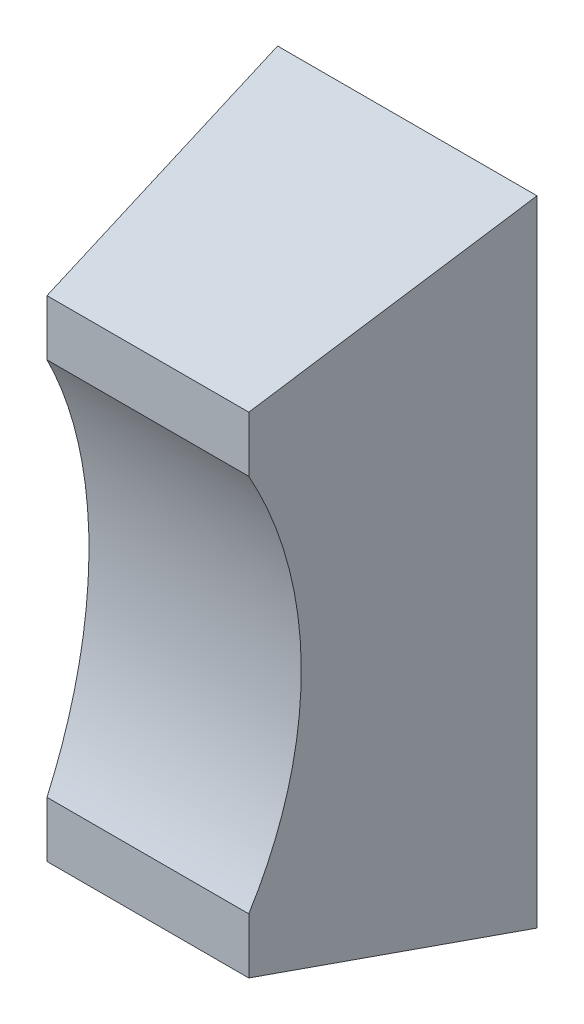
ISO-10303-21;
HEADER;
FILE_DESCRIPTION(('STEP AP214'),'2;1');
FILE_NAME('part.step','',(''),(''),'','','');
FILE_SCHEMA(('AUTOMOTIVE_DESIGN { 1 0 10303 214 1 1 1 1 }'));
ENDSEC;
DATA;
#1=APPLICATION_CONTEXT('core data for automotive mechanical design processes');
#2=APPLICATION_PROTOCOL_DEFINITION('international standard','automotive_design',2000,#1);
#3=PRODUCT_CONTEXT('',#1,'mechanical');
#4=PRODUCT('Part','Part','',(#3));
#5=PRODUCT_RELATED_PRODUCT_CATEGORY('part','',(#4));
#6=PRODUCT_DEFINITION_FORMATION('','',#4);
#7=PRODUCT_DEFINITION_CONTEXT('part definition',#1,'design');
#8=PRODUCT_DEFINITION('design','',#6,#7);
#9=PRODUCT_DEFINITION_SHAPE('','',#8);
#10=(LENGTH_UNIT() NAMED_UNIT(*) SI_UNIT(.MILLI.,.METRE.));
#11=(NAMED_UNIT(*) PLANE_ANGLE_UNIT() SI_UNIT($,.RADIAN.));
#12=(NAMED_UNIT(*) SI_UNIT($,.STERADIAN.) SOLID_ANGLE_UNIT());
#13=UNCERTAINTY_MEASURE_WITH_UNIT(LENGTH_MEASURE(1.E-05),#10,'distance_accuracy_value','');
#14=(GEOMETRIC_REPRESENTATION_CONTEXT(3) GLOBAL_UNCERTAINTY_ASSIGNED_CONTEXT((#13)) GLOBAL_UNIT_ASSIGNED_CONTEXT((#10,
#11,#12)) REPRESENTATION_CONTEXT('',''));
#15=CARTESIAN_POINT('',(0.,0.,0.));
#16=DIRECTION('',(0.,0.,1.));
#17=DIRECTION('',(1.,0.,0.));
#18=AXIS2_PLACEMENT_3D('',#15,#16,#17);
#19=CARTESIAN_POINT('',(0.,0.,9.));
#20=DIRECTION('',(0.,0.,1.));
#21=DIRECTION('',(1.,0.,0.));
#22=AXIS2_PLACEMENT_3D('',#19,#20,#21);
#23=PLANE('',#22);
#24=DIRECTION('',(1.,0.,0.));
#25=VECTOR('',#24,1.);
#26=CARTESIAN_POINT('',(-10.,-6.57200171806336,9.));
#27=LINE('',#26,#25);
#28=CARTESIAN_POINT('',(-3.50000000000006,-6.57200171806232,8.99999999999945));
#29=VERTEX_POINT('',#28);
#30=CARTESIAN_POINT('',(3.5,-6.57200171806336,9.));
#31=VERTEX_POINT('',#30);
#32=EDGE_CURVE('E127',#29,#31,#27,.T.);
#33=ORIENTED_EDGE('',*,*,#32,.F.);
#34=DIRECTION('',(0.,-1.,0.));
#35=VECTOR('',#34,1.);
#36=CARTESIAN_POINT('',(-3.5,8.5,9.));
#37=LINE('',#36,#35);
#38=CARTESIAN_POINT('',(-3.5,-8.5,9.));
#39=VERTEX_POINT('',#38);
#40=EDGE_CURVE('E135',#29,#39,#37,.T.);
#41=ORIENTED_EDGE('',*,*,#40,.T.);
#42=DIRECTION('',(1.,0.,0.));
#43=VECTOR('',#42,1.);
#44=CARTESIAN_POINT('',(-3.5,-8.5,9.));
#45=LINE('',#44,#43);
#46=CARTESIAN_POINT('',(3.5,-8.5,9.));
#47=VERTEX_POINT('',#46);
#48=EDGE_CURVE('E151',#39,#47,#45,.T.);
#49=ORIENTED_EDGE('',*,*,#48,.T.);
#50=DIRECTION('',(0.,1.,0.));
#51=VECTOR('',#50,1.);
#52=CARTESIAN_POINT('',(3.5,8.5,9.));
#53=LINE('',#52,#51);
#54=EDGE_CURVE('E139',#47,#31,#53,.T.);
#55=ORIENTED_EDGE('',*,*,#54,.T.);
#56=EDGE_LOOP('',(#33,#41,#49,#55));
#57=FACE_BOUND('',#56,.T.);
#58=ADVANCED_FACE('F47',(#57),#23,.T.);
#59=CARTESIAN_POINT('',(0.,0.,0.));
#60=DIRECTION('',(0.,0.,1.));
#61=DIRECTION('',(1.,0.,0.));
#62=AXIS2_PLACEMENT_3D('',#59,#60,#61);
#63=PLANE('',#62);
#64=DIRECTION('',(1.,0.,0.));
#65=VECTOR('',#64,1.);
#66=CARTESIAN_POINT('',(0.65,2.2,0.));
#67=LINE('',#66,#65);
#68=CARTESIAN_POINT('',(-0.65,2.2,0.));
#69=VERTEX_POINT('',#68);
#70=CARTESIAN_POINT('',(0.65,2.2,0.));
#71=VERTEX_POINT('',#70);
#72=EDGE_CURVE('E413',#69,#71,#67,.T.);
#73=ORIENTED_EDGE('',*,*,#72,.F.);
#74=DIRECTION('',(0.,1.,0.));
#75=VECTOR('',#74,1.);
#76=CARTESIAN_POINT('',(-0.65,2.2,0.));
#77=LINE('',#76,#75);
#78=CARTESIAN_POINT('',(-0.65,-2.2,0.));
#79=VERTEX_POINT('',#78);
#80=EDGE_CURVE('E74',#79,#69,#77,.T.);
#81=ORIENTED_EDGE('',*,*,#80,.F.);
#82=DIRECTION('',(-1.,0.,0.));
#83=VECTOR('',#82,1.);
#84=CARTESIAN_POINT('',(0.65,-2.2,0.));
#85=LINE('',#84,#83);
#86=CARTESIAN_POINT('',(0.65,-2.2,0.));
#87=VERTEX_POINT('',#86);
#88=EDGE_CURVE('E398',#87,#79,#85,.T.);
#89=ORIENTED_EDGE('',*,*,#88,.F.);
#90=DIRECTION('',(0.,-1.,0.));
#91=VECTOR('',#90,1.);
#92=CARTESIAN_POINT('',(0.65,2.2,0.));
#93=LINE('',#92,#91);
#94=EDGE_CURVE('E417',#71,#87,#93,.T.);
#95=ORIENTED_EDGE('',*,*,#94,.F.);
#96=EDGE_LOOP('',(#73,#81,#89,#95));
#97=FACE_BOUND('',#96,.T.);
#98=DIRECTION('',(0.,1.,0.));
#99=VECTOR('',#98,1.);
#100=CARTESIAN_POINT('',(4.5,11.,0.));
#101=LINE('',#100,#99);
#102=CARTESIAN_POINT('',(4.5,-11.,0.));
#103=VERTEX_POINT('',#102);
#104=CARTESIAN_POINT('',(4.5,11.,0.));
#105=VERTEX_POINT('',#104);
#106=EDGE_CURVE('E290',#103,#105,#101,.T.);
#107=ORIENTED_EDGE('',*,*,#106,.F.);
#108=DIRECTION('',(1.,0.,0.));
#109=VECTOR('',#108,1.);
#110=CARTESIAN_POINT('',(-4.5,-11.,0.));
#111=LINE('',#110,#109);
#112=CARTESIAN_POINT('',(-4.5,-11.,0.));
#113=VERTEX_POINT('',#112);
#114=EDGE_CURVE('E332',#113,#103,#111,.T.);
#115=ORIENTED_EDGE('',*,*,#114,.F.);
#116=DIRECTION('',(0.,-1.,0.));
#117=VECTOR('',#116,1.);
#118=CARTESIAN_POINT('',(-4.5,11.,0.));
#119=LINE('',#118,#117);
#120=CARTESIAN_POINT('',(-4.5,11.,0.));
#121=VERTEX_POINT('',#120);
#122=EDGE_CURVE('E344',#121,#113,#119,.T.);
#123=ORIENTED_EDGE('',*,*,#122,.F.);
#124=DIRECTION('',(-1.,0.,0.));
#125=VECTOR('',#124,1.);
#126=CARTESIAN_POINT('',(-4.5,11.,0.));
#127=LINE('',#126,#125);
#128=EDGE_CURVE('E59',#105,#121,#127,.T.);
#129=ORIENTED_EDGE('',*,*,#128,.F.);
#130=EDGE_LOOP('',(#107,#115,#123,#129));
#131=FACE_BOUND('',#130,.T.);
#132=ADVANCED_FACE('F49',(#97,#131),#63,.F.);
#133=DIRECTION('',(1.,0.,0.));
#134=VECTOR('',#133,1.);
#135=CARTESIAN_POINT('',(-10.,6.57200171806336,9.));
#136=LINE('',#135,#134);
#137=CARTESIAN_POINT('',(3.5,6.57200171806336,9.));
#138=VERTEX_POINT('',#137);
#139=CARTESIAN_POINT('',(-3.5,6.57200171806336,9.));
#140=VERTEX_POINT('',#139);
#141=EDGE_CURVE('E66',#138,#140,#136,.F.);
#142=ORIENTED_EDGE('',*,*,#141,.F.);
#143=CARTESIAN_POINT('',(3.5,8.5,9.));
#144=VERTEX_POINT('',#143);
#145=EDGE_CURVE('E52',#138,#144,#53,.T.);
#146=ORIENTED_EDGE('',*,*,#145,.T.);
#147=DIRECTION('',(-1.,0.,0.));
#148=VECTOR('',#147,1.);
#149=CARTESIAN_POINT('',(-3.5,8.5,9.));
#150=LINE('',#149,#148);
#151=CARTESIAN_POINT('',(-3.5,8.5,9.));
#152=VERTEX_POINT('',#151);
#153=EDGE_CURVE('E193',#144,#152,#150,.T.);
#154=ORIENTED_EDGE('',*,*,#153,.T.);
#155=EDGE_CURVE('E150',#152,#140,#37,.T.);
#156=ORIENTED_EDGE('',*,*,#155,.T.);
#157=EDGE_LOOP('',(#142,#146,#154,#156));
#158=FACE_BOUND('',#157,.T.);
#159=ADVANCED_FACE('F208',(#158),#23,.T.);
#160=CARTESIAN_POINT('',(4.44512195121951,0.,0.49390243902439));
#161=DIRECTION('',(0.993883734673619,0.,0.110431526074847));
#162=DIRECTION('',(0.110431526074847,0.,-0.993883734673619));
#163=AXIS2_PLACEMENT_3D('',#160,#161,#162);
#164=PLANE('',#163);
#165=CARTESIAN_POINT('',(2.12757541750436,0.,21.3518212424608));
#166=DIRECTION('',(0.993883734673619,0.,0.110431526074847));
#167=DIRECTION('',(0.110431526074847,0.,-0.993883734673619));
#168=AXIS2_PLACEMENT_3D('',#165,#166,#167);
#169=ELLIPSE('',#168,14.077480903741,13.9913792954067);
#170=EDGE_CURVE('E142',#31,#138,#169,.T.);
#171=ORIENTED_EDGE('',*,*,#170,.F.);
#172=ORIENTED_EDGE('',*,*,#54,.F.);
#173=DIRECTION('',(0.10644925908247,-0.266123147706175,-0.958043331742229));
#174=VECTOR('',#173,1.);
#175=CARTESIAN_POINT('',(3.5,-8.5,9.));
#176=LINE('',#175,#174);
#177=EDGE_CURVE('E197',#47,#103,#176,.T.);
#178=ORIENTED_EDGE('',*,*,#177,.T.);
#179=ORIENTED_EDGE('',*,*,#106,.T.);
#180=DIRECTION('',(0.10644925908247,0.266123147706175,-0.958043331742229));
#181=VECTOR('',#180,1.);
#182=CARTESIAN_POINT('',(3.5,8.5,9.));
#183=LINE('',#182,#181);
#184=EDGE_CURVE('E270',#144,#105,#183,.T.);
#185=ORIENTED_EDGE('',*,*,#184,.F.);
#186=ORIENTED_EDGE('',*,*,#145,.F.);
#187=EDGE_LOOP('',(#171,#172,#178,#179,#185,#186));
#188=FACE_BOUND('',#187,.T.);
#189=ADVANCED_FACE('F218',(#188),#164,.T.);
#190=CARTESIAN_POINT('',(0.,10.2120343839542,2.83667621776504));
#191=DIRECTION('',(0.,0.963517909629941,0.267643863786094));
#192=DIRECTION('',(0.,-0.267643863786095,0.963517909629941));
#193=AXIS2_PLACEMENT_3D('',#190,#191,#192);
#194=PLANE('',#193);
#195=ORIENTED_EDGE('',*,*,#184,.T.);
#196=ORIENTED_EDGE('',*,*,#128,.T.);
#197=DIRECTION('',(-0.10644925908247,0.266123147706175,-0.958043331742229));
#198=VECTOR('',#197,1.);
#199=CARTESIAN_POINT('',(-3.5,8.5,9.));
#200=LINE('',#199,#198);
#201=EDGE_CURVE('E285',#152,#121,#200,.T.);
#202=ORIENTED_EDGE('',*,*,#201,.F.);
#203=ORIENTED_EDGE('',*,*,#153,.F.);
#204=EDGE_LOOP('',(#195,#196,#202,#203));
#205=FACE_BOUND('',#204,.T.);
#206=ADVANCED_FACE('F304',(#205),#194,.T.);
#207=CARTESIAN_POINT('',(0.,-10.2120343839542,2.83667621776504));
#208=DIRECTION('',(0.,-0.963517909629941,0.267643863786094));
#209=DIRECTION('',(0.,-0.267643863786095,-0.963517909629941));
#210=AXIS2_PLACEMENT_3D('',#207,#208,#209);
#211=PLANE('',#210);
#212=DIRECTION('',(-0.10644925908247,-0.266123147706175,-0.958043331742229));
#213=VECTOR('',#212,1.);
#214=CARTESIAN_POINT('',(-3.5,-8.5,9.));
#215=LINE('',#214,#213);
#216=EDGE_CURVE('E148',#39,#113,#215,.T.);
#217=ORIENTED_EDGE('',*,*,#216,.T.);
#218=ORIENTED_EDGE('',*,*,#114,.T.);
#219=ORIENTED_EDGE('',*,*,#177,.F.);
#220=ORIENTED_EDGE('',*,*,#48,.F.);
#221=EDGE_LOOP('',(#217,#218,#219,#220));
#222=FACE_BOUND('',#221,.T.);
#223=ADVANCED_FACE('F174',(#222),#211,.T.);
#224=CARTESIAN_POINT('',(-4.44512195121951,0.,0.49390243902439));
#225=DIRECTION('',(-0.993883734673619,0.,0.110431526074847));
#226=DIRECTION('',(0.110431526074847,0.,0.993883734673619));
#227=AXIS2_PLACEMENT_3D('',#224,#225,#226);
#228=PLANE('',#227);
#229=CARTESIAN_POINT('',(-2.12757541750436,0.,21.3518212424608));
#230=DIRECTION('',(-0.993883734673619,0.,0.110431526074847));
#231=DIRECTION('',(0.110431526074847,0.,0.993883734673619));
#232=AXIS2_PLACEMENT_3D('',#229,#230,#231);
#233=ELLIPSE('',#232,14.077480903741,13.9913792954067);
#234=EDGE_CURVE('E12',#140,#29,#233,.T.);
#235=ORIENTED_EDGE('',*,*,#234,.F.);
#236=ORIENTED_EDGE('',*,*,#155,.F.);
#237=ORIENTED_EDGE('',*,*,#201,.T.);
#238=ORIENTED_EDGE('',*,*,#122,.T.);
#239=ORIENTED_EDGE('',*,*,#216,.F.);
#240=ORIENTED_EDGE('',*,*,#40,.F.);
#241=EDGE_LOOP('',(#235,#236,#237,#238,#239,#240));
#242=FACE_BOUND('',#241,.T.);
#243=ADVANCED_FACE('F146',(#242),#228,.T.);
#244=CARTESIAN_POINT('',(-0.65,2.2,5.));
#245=DIRECTION('',(-1.,0.,0.));
#246=DIRECTION('',(0.,0.,1.));
#247=AXIS2_PLACEMENT_3D('',#244,#245,#246);
#248=PLANE('',#247);
#249=ORIENTED_EDGE('',*,*,#80,.T.);
#250=DIRECTION('',(0.,0.,-1.));
#251=VECTOR('',#250,1.);
#252=CARTESIAN_POINT('',(-0.65,2.2,5.));
#253=LINE('',#252,#251);
#254=CARTESIAN_POINT('',(-0.65,2.2,5.));
#255=VERTEX_POINT('',#254);
#256=EDGE_CURVE('E410',#255,#69,#253,.T.);
#257=ORIENTED_EDGE('',*,*,#256,.F.);
#258=DIRECTION('',(0.,1.,0.));
#259=VECTOR('',#258,1.);
#260=CARTESIAN_POINT('',(-0.65,2.2,5.));
#261=LINE('',#260,#259);
#262=CARTESIAN_POINT('',(-0.65,-2.2,5.));
#263=VERTEX_POINT('',#262);
#264=EDGE_CURVE('E393',#263,#255,#261,.T.);
#265=ORIENTED_EDGE('',*,*,#264,.F.);
#266=DIRECTION('',(0.,0.,-1.));
#267=VECTOR('',#266,1.);
#268=CARTESIAN_POINT('',(-0.65,-2.2,5.));
#269=LINE('',#268,#267);
#270=EDGE_CURVE('E424',#263,#79,#269,.T.);
#271=ORIENTED_EDGE('',*,*,#270,.T.);
#272=EDGE_LOOP('',(#249,#257,#265,#271));
#273=FACE_BOUND('',#272,.T.);
#274=ADVANCED_FACE('F173',(#273),#248,.F.);
#275=CARTESIAN_POINT('',(0.65,-2.2,5.));
#276=DIRECTION('',(0.,-1.,0.));
#277=DIRECTION('',(0.,0.,-1.));
#278=AXIS2_PLACEMENT_3D('',#275,#276,#277);
#279=PLANE('',#278);
#280=ORIENTED_EDGE('',*,*,#88,.T.);
#281=ORIENTED_EDGE('',*,*,#270,.F.);
#282=DIRECTION('',(-1.,0.,0.));
#283=VECTOR('',#282,1.);
#284=CARTESIAN_POINT('',(0.65,-2.2,5.));
#285=LINE('',#284,#283);
#286=CARTESIAN_POINT('',(0.65,-2.2,5.));
#287=VERTEX_POINT('',#286);
#288=EDGE_CURVE('E406',#287,#263,#285,.T.);
#289=ORIENTED_EDGE('',*,*,#288,.F.);
#290=DIRECTION('',(0.,0.,-1.));
#291=VECTOR('',#290,1.);
#292=CARTESIAN_POINT('',(0.65,-2.2,5.));
#293=LINE('',#292,#291);
#294=EDGE_CURVE('E427',#287,#87,#293,.T.);
#295=ORIENTED_EDGE('',*,*,#294,.T.);
#296=EDGE_LOOP('',(#280,#281,#289,#295));
#297=FACE_BOUND('',#296,.T.);
#298=ADVANCED_FACE('F448',(#297),#279,.F.);
#299=CARTESIAN_POINT('',(0.65,2.2,5.));
#300=DIRECTION('',(1.,0.,0.));
#301=DIRECTION('',(0.,0.,-1.));
#302=AXIS2_PLACEMENT_3D('',#299,#300,#301);
#303=PLANE('',#302);
#304=ORIENTED_EDGE('',*,*,#94,.T.);
#305=ORIENTED_EDGE('',*,*,#294,.F.);
#306=DIRECTION('',(0.,-1.,0.));
#307=VECTOR('',#306,1.);
#308=CARTESIAN_POINT('',(0.65,2.2,5.));
#309=LINE('',#308,#307);
#310=CARTESIAN_POINT('',(0.65,2.2,5.));
#311=VERTEX_POINT('',#310);
#312=EDGE_CURVE('E402',#311,#287,#309,.T.);
#313=ORIENTED_EDGE('',*,*,#312,.F.);
#314=DIRECTION('',(0.,0.,-1.));
#315=VECTOR('',#314,1.);
#316=CARTESIAN_POINT('',(0.65,2.2,5.));
#317=LINE('',#316,#315);
#318=EDGE_CURVE('E430',#311,#71,#317,.T.);
#319=ORIENTED_EDGE('',*,*,#318,.T.);
#320=EDGE_LOOP('',(#304,#305,#313,#319));
#321=FACE_BOUND('',#320,.T.);
#322=ADVANCED_FACE('F442',(#321),#303,.F.);
#323=CARTESIAN_POINT('',(0.65,2.2,5.));
#324=DIRECTION('',(0.,1.,0.));
#325=DIRECTION('',(0.,0.,1.));
#326=AXIS2_PLACEMENT_3D('',#323,#324,#325);
#327=PLANE('',#326);
#328=ORIENTED_EDGE('',*,*,#72,.T.);
#329=ORIENTED_EDGE('',*,*,#318,.F.);
#330=DIRECTION('',(1.,0.,0.));
#331=VECTOR('',#330,1.);
#332=CARTESIAN_POINT('',(0.65,2.2,5.));
#333=LINE('',#332,#331);
#334=EDGE_CURVE('E397',#255,#311,#333,.T.);
#335=ORIENTED_EDGE('',*,*,#334,.F.);
#336=ORIENTED_EDGE('',*,*,#256,.T.);
#337=EDGE_LOOP('',(#328,#329,#335,#336));
#338=FACE_BOUND('',#337,.T.);
#339=ADVANCED_FACE('F436',(#338),#327,.F.);
#340=CARTESIAN_POINT('',(0.,0.,5.));
#341=DIRECTION('',(0.,0.,-1.));
#342=DIRECTION('',(-1.,0.,0.));
#343=AXIS2_PLACEMENT_3D('',#340,#341,#342);
#344=PLANE('',#343);
#345=ORIENTED_EDGE('',*,*,#264,.T.);
#346=ORIENTED_EDGE('',*,*,#334,.T.);
#347=ORIENTED_EDGE('',*,*,#312,.T.);
#348=ORIENTED_EDGE('',*,*,#288,.T.);
#349=EDGE_LOOP('',(#345,#346,#347,#348));
#350=FACE_BOUND('',#349,.T.);
#351=ADVANCED_FACE('F446',(#350),#344,.T.);
#352=CARTESIAN_POINT('',(-10.,0.,21.3518212424608));
#353=DIRECTION('',(1.,0.,0.));
#354=DIRECTION('',(0.,0.,-1.));
#355=AXIS2_PLACEMENT_3D('',#352,#353,#354);
#356=CYLINDRICAL_SURFACE('',#355,13.9913792954067);
#357=ORIENTED_EDGE('',*,*,#170,.T.);
#358=ORIENTED_EDGE('',*,*,#141,.T.);
#359=ORIENTED_EDGE('',*,*,#234,.T.);
#360=ORIENTED_EDGE('',*,*,#32,.T.);
#361=EDGE_LOOP('',(#357,#358,#359,#360));
#362=FACE_BOUND('',#361,.T.);
#363=ADVANCED_FACE('F126',(#362),#356,.F.);
#364=CLOSED_SHELL('',(#58,#132,#159,#189,#206,#223,#243,#274,#298,#322,#339,#351,#363));
#365=MANIFOLD_SOLID_BREP('B2',#364);
#366=ADVANCED_BREP_SHAPE_REPRESENTATION('',(#18,#365),#14);
#367=SHAPE_DEFINITION_REPRESENTATION(#9,#366);
ENDSEC;
END-ISO-10303-21;
